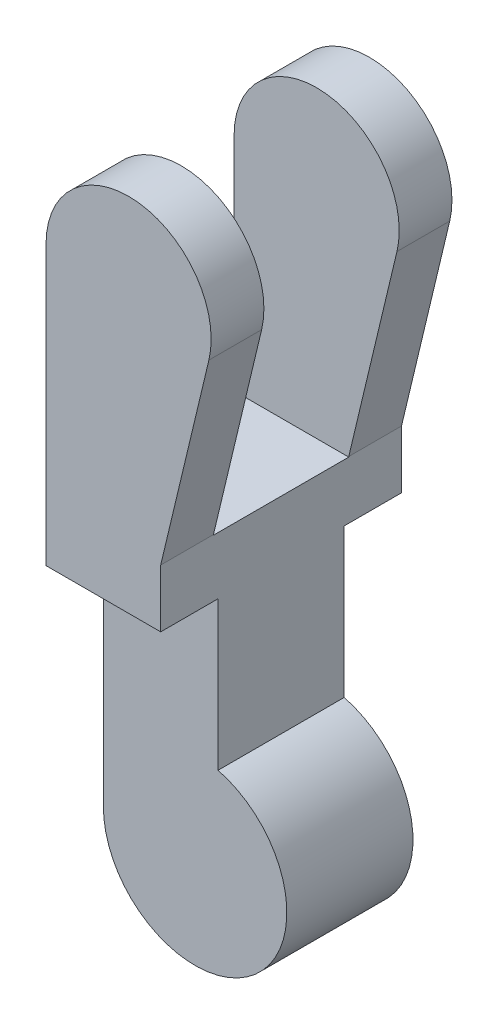
ISO-10303-21;
HEADER;
FILE_DESCRIPTION(('STEP AP214'),'2;1');
FILE_NAME('part.step','',(''),(''),'','','');
FILE_SCHEMA(('AUTOMOTIVE_DESIGN { 1 0 10303 214 1 1 1 1 }'));
ENDSEC;
DATA;
#1=APPLICATION_CONTEXT('core data for automotive mechanical design processes');
#2=APPLICATION_PROTOCOL_DEFINITION('international standard','automotive_design',2000,#1);
#3=PRODUCT_CONTEXT('',#1,'mechanical');
#4=PRODUCT('Part','Part','',(#3));
#5=PRODUCT_RELATED_PRODUCT_CATEGORY('part','',(#4));
#6=PRODUCT_DEFINITION_FORMATION('','',#4);
#7=PRODUCT_DEFINITION_CONTEXT('part definition',#1,'design');
#8=PRODUCT_DEFINITION('design','',#6,#7);
#9=PRODUCT_DEFINITION_SHAPE('','',#8);
#10=(LENGTH_UNIT() NAMED_UNIT(*) SI_UNIT(.MILLI.,.METRE.));
#11=(NAMED_UNIT(*) PLANE_ANGLE_UNIT() SI_UNIT($,.RADIAN.));
#12=(NAMED_UNIT(*) SI_UNIT($,.STERADIAN.) SOLID_ANGLE_UNIT());
#13=UNCERTAINTY_MEASURE_WITH_UNIT(LENGTH_MEASURE(1.E-05),#10,'distance_accuracy_value','');
#14=(GEOMETRIC_REPRESENTATION_CONTEXT(3) GLOBAL_UNCERTAINTY_ASSIGNED_CONTEXT((#13)) GLOBAL_UNIT_ASSIGNED_CONTEXT((#10,
#11,#12)) REPRESENTATION_CONTEXT('',''));
#15=CARTESIAN_POINT('',(0.,0.,0.));
#16=DIRECTION('',(0.,0.,1.));
#17=DIRECTION('',(1.,0.,0.));
#18=AXIS2_PLACEMENT_3D('',#15,#16,#17);
#19=CARTESIAN_POINT('',(20.,257.459666924148,105.));
#20=DIRECTION('',(-0.972594243663536,0.232509004540803,0.));
#21=DIRECTION('',(-0.232509004540803,-0.972594243663536,0.));
#22=AXIS2_PLACEMENT_3D('',#19,#20,#21);
#23=PLANE('',#22);
#24=DIRECTION('',(0.,0.,-1.));
#25=VECTOR('',#24,1.);
#26=CARTESIAN_POINT('',(20.,257.459666924148,105.));
#27=LINE('',#26,#25);
#28=CARTESIAN_POINT('',(20.,257.459666924148,105.));
#29=VERTEX_POINT('',#28);
#30=CARTESIAN_POINT('',(20.,257.459666924148,59.));
#31=VERTEX_POINT('',#30);
#32=EDGE_CURVE('E185',#29,#31,#27,.T.);
#33=ORIENTED_EDGE('',*,*,#32,.T.);
#34=DIRECTION('',(0.232509004540803,0.972594243663536,0.));
#35=VECTOR('',#34,1.);
#36=CARTESIAN_POINT('',(20.,257.459666924148,59.));
#37=LINE('',#36,#35);
#38=CARTESIAN_POINT('',(62.0267855437745,433.259351673062,59.));
#39=VERTEX_POINT('',#38);
#40=EDGE_CURVE('E241',#31,#39,#37,.T.);
#41=ORIENTED_EDGE('',*,*,#40,.T.);
#42=DIRECTION('',(0.,0.,-1.));
#43=VECTOR('',#42,1.);
#44=CARTESIAN_POINT('',(62.0267855437745,433.259351673062,105.));
#45=LINE('',#44,#43);
#46=CARTESIAN_POINT('',(62.0267855437745,433.259351673062,105.));
#47=VERTEX_POINT('',#46);
#48=EDGE_CURVE('E176',#47,#39,#45,.T.);
#49=ORIENTED_EDGE('',*,*,#48,.F.);
#50=DIRECTION('',(0.232509004540803,0.972594243663536,0.));
#51=VECTOR('',#50,1.);
#52=CARTESIAN_POINT('',(20.,257.459666924148,105.));
#53=LINE('',#52,#51);
#54=EDGE_CURVE('E251',#29,#47,#53,.T.);
#55=ORIENTED_EDGE('',*,*,#54,.F.);
#56=EDGE_LOOP('',(#33,#41,#49,#55));
#57=FACE_BOUND('',#56,.T.);
#58=ADVANCED_FACE('F39',(#57),#23,.F.);
#59=CARTESIAN_POINT('',(-8.00000000000001,450.,105.));
#60=DIRECTION('',(0.,0.,-1.));
#61=DIRECTION('',(-1.,0.,0.));
#62=AXIS2_PLACEMENT_3D('',#59,#60,#61);
#63=CYLINDRICAL_SURFACE('',#62,72.);
#64=CARTESIAN_POINT('',(-8.00000000000001,450.,59.));
#65=DIRECTION('',(0.,0.,1.));
#66=DIRECTION('',(0.,-1.,0.));
#67=AXIS2_PLACEMENT_3D('',#64,#65,#66);
#68=CIRCLE('',#67,72.);
#69=CARTESIAN_POINT('',(-80.,450.,59.));
#70=VERTEX_POINT('',#69);
#71=EDGE_CURVE('E238',#39,#70,#68,.T.);
#72=ORIENTED_EDGE('',*,*,#71,.T.);
#73=DIRECTION('',(0.,0.,-1.));
#74=VECTOR('',#73,1.);
#75=CARTESIAN_POINT('',(-80.,450.,105.));
#76=LINE('',#75,#74);
#77=CARTESIAN_POINT('',(-80.,450.,105.));
#78=VERTEX_POINT('',#77);
#79=EDGE_CURVE('E164',#78,#70,#76,.T.);
#80=ORIENTED_EDGE('',*,*,#79,.F.);
#81=CARTESIAN_POINT('',(-8.00000000000001,450.,105.));
#82=DIRECTION('',(0.,0.,1.));
#83=DIRECTION('',(1.,0.,0.));
#84=AXIS2_PLACEMENT_3D('',#81,#82,#83);
#85=CIRCLE('',#84,72.);
#86=EDGE_CURVE('E255',#47,#78,#85,.T.);
#87=ORIENTED_EDGE('',*,*,#86,.F.);
#88=ORIENTED_EDGE('',*,*,#48,.T.);
#89=EDGE_LOOP('',(#72,#80,#87,#88));
#90=FACE_BOUND('',#89,.T.);
#91=ADVANCED_FACE('F330',(#90),#63,.T.);
#92=CARTESIAN_POINT('',(0.,0.,105.));
#93=DIRECTION('',(0.,0.,-1.));
#94=DIRECTION('',(-1.,0.,0.));
#95=AXIS2_PLACEMENT_3D('',#92,#93,#94);
#96=CYLINDRICAL_SURFACE('',#95,80.);
#97=DIRECTION('',(0.,0.,-1.));
#98=VECTOR('',#97,1.);
#99=CARTESIAN_POINT('',(20.,77.4596669241483,105.));
#100=LINE('',#99,#98);
#101=CARTESIAN_POINT('',(20.,77.4596669241483,55.));
#102=VERTEX_POINT('',#101);
#103=CARTESIAN_POINT('',(20.,77.4596669241483,-55.));
#104=VERTEX_POINT('',#103);
#105=EDGE_CURVE('E48',#102,#104,#100,.T.);
#106=ORIENTED_EDGE('',*,*,#105,.F.);
#107=CARTESIAN_POINT('',(0.,0.,55.));
#108=DIRECTION('',(0.,0.,-1.));
#109=DIRECTION('',(0.,1.,0.));
#110=AXIS2_PLACEMENT_3D('',#107,#108,#109);
#111=CIRCLE('',#110,80.);
#112=CARTESIAN_POINT('',(-80.,0.,55.));
#113=VERTEX_POINT('',#112);
#114=EDGE_CURVE('E201',#102,#113,#111,.T.);
#115=ORIENTED_EDGE('',*,*,#114,.T.);
#116=DIRECTION('',(0.,0.,-1.));
#117=VECTOR('',#116,1.);
#118=CARTESIAN_POINT('',(-80.,0.,105.));
#119=LINE('',#118,#117);
#120=CARTESIAN_POINT('',(-80.,0.,-55.));
#121=VERTEX_POINT('',#120);
#122=EDGE_CURVE('E178',#113,#121,#119,.T.);
#123=ORIENTED_EDGE('',*,*,#122,.T.);
#124=CARTESIAN_POINT('',(0.,0.,-55.));
#125=DIRECTION('',(0.,0.,1.));
#126=DIRECTION('',(0.,-1.,0.));
#127=AXIS2_PLACEMENT_3D('',#124,#125,#126);
#128=CIRCLE('',#127,80.);
#129=EDGE_CURVE('E203',#121,#104,#128,.T.);
#130=ORIENTED_EDGE('',*,*,#129,.T.);
#131=EDGE_LOOP('',(#106,#115,#123,#130));
#132=FACE_BOUND('',#131,.T.);
#133=ADVANCED_FACE('F41',(#132),#96,.T.);
#134=CARTESIAN_POINT('',(20.,257.459666924148,105.));
#135=DIRECTION('',(-1.,0.,0.));
#136=DIRECTION('',(0.,-1.,0.));
#137=AXIS2_PLACEMENT_3D('',#134,#135,#136);
#138=PLANE('',#137);
#139=DIRECTION('',(0.,0.,1.));
#140=VECTOR('',#139,1.);
#141=CARTESIAN_POINT('',(20.,257.,105.));
#142=LINE('',#141,#140);
#143=CARTESIAN_POINT('',(20.,257.,-59.));
#144=VERTEX_POINT('',#143);
#145=CARTESIAN_POINT('',(20.,257.,59.));
#146=VERTEX_POINT('',#145);
#147=EDGE_CURVE('E224',#144,#146,#142,.T.);
#148=ORIENTED_EDGE('',*,*,#147,.T.);
#149=DIRECTION('',(0.,1.,0.));
#150=VECTOR('',#149,1.);
#151=CARTESIAN_POINT('',(20.,257.459666924148,59.));
#152=LINE('',#151,#150);
#153=EDGE_CURVE('E148',#146,#31,#152,.T.);
#154=ORIENTED_EDGE('',*,*,#153,.T.);
#155=ORIENTED_EDGE('',*,*,#32,.F.);
#156=DIRECTION('',(0.,1.,0.));
#157=VECTOR('',#156,1.);
#158=CARTESIAN_POINT('',(20.,257.459666924148,105.));
#159=LINE('',#158,#157);
#160=CARTESIAN_POINT('',(20.,207.,105.));
#161=VERTEX_POINT('',#160);
#162=EDGE_CURVE('E248',#161,#29,#159,.T.);
#163=ORIENTED_EDGE('',*,*,#162,.F.);
#164=DIRECTION('',(0.,0.,-1.));
#165=VECTOR('',#164,1.);
#166=CARTESIAN_POINT('',(20.,207.,105.));
#167=LINE('',#166,#165);
#168=CARTESIAN_POINT('',(20.,207.,55.));
#169=VERTEX_POINT('',#168);
#170=EDGE_CURVE('E63',#161,#169,#167,.T.);
#171=ORIENTED_EDGE('',*,*,#170,.T.);
#172=DIRECTION('',(0.,-1.,0.));
#173=VECTOR('',#172,1.);
#174=CARTESIAN_POINT('',(20.,257.459666924148,55.));
#175=LINE('',#174,#173);
#176=EDGE_CURVE('E198',#169,#102,#175,.T.);
#177=ORIENTED_EDGE('',*,*,#176,.T.);
#178=ORIENTED_EDGE('',*,*,#105,.T.);
#179=DIRECTION('',(0.,1.,0.));
#180=VECTOR('',#179,1.);
#181=CARTESIAN_POINT('',(20.,257.459666924148,-55.));
#182=LINE('',#181,#180);
#183=CARTESIAN_POINT('',(20.,207.,-55.));
#184=VERTEX_POINT('',#183);
#185=EDGE_CURVE('E197',#104,#184,#182,.T.);
#186=ORIENTED_EDGE('',*,*,#185,.T.);
#187=DIRECTION('',(0.,0.,-1.));
#188=VECTOR('',#187,1.);
#189=CARTESIAN_POINT('',(20.,207.,105.));
#190=LINE('',#189,#188);
#191=CARTESIAN_POINT('',(20.,207.,-105.));
#192=VERTEX_POINT('',#191);
#193=EDGE_CURVE('E216',#184,#192,#190,.T.);
#194=ORIENTED_EDGE('',*,*,#193,.T.);
#195=DIRECTION('',(0.,1.,0.));
#196=VECTOR('',#195,1.);
#197=CARTESIAN_POINT('',(20.,257.459666924148,-105.));
#198=LINE('',#197,#196);
#199=CARTESIAN_POINT('',(20.,257.459666924148,-105.));
#200=VERTEX_POINT('',#199);
#201=EDGE_CURVE('E247',#192,#200,#198,.T.);
#202=ORIENTED_EDGE('',*,*,#201,.T.);
#203=CARTESIAN_POINT('',(20.,257.459666924148,-59.));
#204=VERTEX_POINT('',#203);
#205=EDGE_CURVE('E184',#204,#200,#27,.T.);
#206=ORIENTED_EDGE('',*,*,#205,.F.);
#207=DIRECTION('',(0.,-1.,0.));
#208=VECTOR('',#207,1.);
#209=CARTESIAN_POINT('',(20.,257.459666924148,-59.));
#210=LINE('',#209,#208);
#211=EDGE_CURVE('E234',#204,#144,#210,.T.);
#212=ORIENTED_EDGE('',*,*,#211,.T.);
#213=EDGE_LOOP('',(#148,#154,#155,#163,#171,#177,#178,#186,#194,#202,#206,#212));
#214=FACE_BOUND('',#213,.T.);
#215=ADVANCED_FACE('F194',(#214),#138,.F.);
#216=CARTESIAN_POINT('',(62.0267855437745,433.259351673062,-59.));
#217=VERTEX_POINT('',#216);
#218=CARTESIAN_POINT('',(62.0267855437745,433.259351673062,-105.));
#219=VERTEX_POINT('',#218);
#220=EDGE_CURVE('E171',#217,#219,#45,.T.);
#221=ORIENTED_EDGE('',*,*,#220,.F.);
#222=DIRECTION('',(-0.232509004540803,-0.972594243663536,0.));
#223=VECTOR('',#222,1.);
#224=CARTESIAN_POINT('',(20.,257.459666924148,-59.));
#225=LINE('',#224,#223);
#226=EDGE_CURVE('E230',#217,#204,#225,.T.);
#227=ORIENTED_EDGE('',*,*,#226,.T.);
#228=ORIENTED_EDGE('',*,*,#205,.T.);
#229=DIRECTION('',(0.232509004540803,0.972594243663536,0.));
#230=VECTOR('',#229,1.);
#231=CARTESIAN_POINT('',(20.,257.459666924148,-105.));
#232=LINE('',#231,#230);
#233=EDGE_CURVE('E263',#200,#219,#232,.T.);
#234=ORIENTED_EDGE('',*,*,#233,.T.);
#235=EDGE_LOOP('',(#221,#227,#228,#234));
#236=FACE_BOUND('',#235,.T.);
#237=ADVANCED_FACE('F333',(#236),#23,.F.);
#238=CARTESIAN_POINT('',(-8.00000000000001,450.,-59.));
#239=DIRECTION('',(0.,0.,-1.));
#240=DIRECTION('',(0.,1.,0.));
#241=AXIS2_PLACEMENT_3D('',#238,#239,#240);
#242=CIRCLE('',#241,72.);
#243=CARTESIAN_POINT('',(-80.,450.,-59.));
#244=VERTEX_POINT('',#243);
#245=EDGE_CURVE('E227',#244,#217,#242,.T.);
#246=ORIENTED_EDGE('',*,*,#245,.T.);
#247=ORIENTED_EDGE('',*,*,#220,.T.);
#248=CARTESIAN_POINT('',(-8.00000000000001,450.,-105.));
#249=DIRECTION('',(0.,0.,1.));
#250=DIRECTION('',(1.,0.,0.));
#251=AXIS2_PLACEMENT_3D('',#248,#249,#250);
#252=CIRCLE('',#251,72.);
#253=CARTESIAN_POINT('',(-80.,450.,-105.));
#254=VERTEX_POINT('',#253);
#255=EDGE_CURVE('E267',#219,#254,#252,.T.);
#256=ORIENTED_EDGE('',*,*,#255,.T.);
#257=EDGE_CURVE('E172',#244,#254,#76,.T.);
#258=ORIENTED_EDGE('',*,*,#257,.F.);
#259=EDGE_LOOP('',(#246,#247,#256,#258));
#260=FACE_BOUND('',#259,.T.);
#261=ADVANCED_FACE('F338',(#260),#63,.T.);
#262=CARTESIAN_POINT('',(-80.,0.,105.));
#263=DIRECTION('',(1.,0.,0.));
#264=DIRECTION('',(0.,0.,-1.));
#265=AXIS2_PLACEMENT_3D('',#262,#263,#264);
#266=PLANE('',#265);
#267=ORIENTED_EDGE('',*,*,#79,.T.);
#268=DIRECTION('',(0.,-1.,0.));
#269=VECTOR('',#268,1.);
#270=CARTESIAN_POINT('',(-80.,0.,59.0000000000001));
#271=LINE('',#270,#269);
#272=CARTESIAN_POINT('',(-80.,257.,59.));
#273=VERTEX_POINT('',#272);
#274=EDGE_CURVE('E11',#70,#273,#271,.T.);
#275=ORIENTED_EDGE('',*,*,#274,.T.);
#276=DIRECTION('',(0.,0.,-1.));
#277=VECTOR('',#276,1.);
#278=CARTESIAN_POINT('',(-80.,257.,59.));
#279=LINE('',#278,#277);
#280=CARTESIAN_POINT('',(-80.,257.,-59.));
#281=VERTEX_POINT('',#280);
#282=EDGE_CURVE('E155',#273,#281,#279,.T.);
#283=ORIENTED_EDGE('',*,*,#282,.T.);
#284=DIRECTION('',(0.,1.,0.));
#285=VECTOR('',#284,1.);
#286=CARTESIAN_POINT('',(-80.,522.,-59.));
#287=LINE('',#286,#285);
#288=EDGE_CURVE('E55',#281,#244,#287,.T.);
#289=ORIENTED_EDGE('',*,*,#288,.T.);
#290=ORIENTED_EDGE('',*,*,#257,.T.);
#291=DIRECTION('',(0.,-1.,0.));
#292=VECTOR('',#291,1.);
#293=CARTESIAN_POINT('',(-80.,0.,-105.));
#294=LINE('',#293,#292);
#295=CARTESIAN_POINT('',(-80.,207.,-105.));
#296=VERTEX_POINT('',#295);
#297=EDGE_CURVE('E252',#254,#296,#294,.T.);
#298=ORIENTED_EDGE('',*,*,#297,.T.);
#299=DIRECTION('',(0.,0.,1.));
#300=VECTOR('',#299,1.);
#301=CARTESIAN_POINT('',(-80.,207.,-105.));
#302=LINE('',#301,#300);
#303=CARTESIAN_POINT('',(-80.,207.,-55.));
#304=VERTEX_POINT('',#303);
#305=EDGE_CURVE('E274',#296,#304,#302,.T.);
#306=ORIENTED_EDGE('',*,*,#305,.T.);
#307=DIRECTION('',(0.,-1.,0.));
#308=VECTOR('',#307,1.);
#309=CARTESIAN_POINT('',(-80.,207.,-55.));
#310=LINE('',#309,#308);
#311=EDGE_CURVE('E285',#304,#121,#310,.T.);
#312=ORIENTED_EDGE('',*,*,#311,.T.);
#313=ORIENTED_EDGE('',*,*,#122,.F.);
#314=DIRECTION('',(0.,1.,0.));
#315=VECTOR('',#314,1.);
#316=CARTESIAN_POINT('',(-80.,207.,55.));
#317=LINE('',#316,#315);
#318=CARTESIAN_POINT('',(-80.,207.,55.));
#319=VERTEX_POINT('',#318);
#320=EDGE_CURVE('E289',#113,#319,#317,.T.);
#321=ORIENTED_EDGE('',*,*,#320,.T.);
#322=DIRECTION('',(0.,0.,1.));
#323=VECTOR('',#322,1.);
#324=CARTESIAN_POINT('',(-80.,207.,105.));
#325=LINE('',#324,#323);
#326=CARTESIAN_POINT('',(-80.,207.,105.));
#327=VERTEX_POINT('',#326);
#328=EDGE_CURVE('E300',#319,#327,#325,.T.);
#329=ORIENTED_EDGE('',*,*,#328,.T.);
#330=DIRECTION('',(0.,-1.,0.));
#331=VECTOR('',#330,1.);
#332=CARTESIAN_POINT('',(-80.,0.,105.));
#333=LINE('',#332,#331);
#334=EDGE_CURVE('E167',#78,#327,#333,.T.);
#335=ORIENTED_EDGE('',*,*,#334,.F.);
#336=EDGE_LOOP('',(#267,#275,#283,#289,#290,#298,#306,#312,#313,#321,#329,#335));
#337=FACE_BOUND('',#336,.T.);
#338=ADVANCED_FACE('F161',(#337),#266,.F.);
#339=CARTESIAN_POINT('',(0.,0.,105.));
#340=DIRECTION('',(0.,0.,1.));
#341=DIRECTION('',(1.,0.,0.));
#342=AXIS2_PLACEMENT_3D('',#339,#340,#341);
#343=PLANE('',#342);
#344=DIRECTION('',(1.,0.,0.));
#345=VECTOR('',#344,1.);
#346=CARTESIAN_POINT('',(-80.,207.,105.));
#347=LINE('',#346,#345);
#348=EDGE_CURVE('E159',#327,#161,#347,.T.);
#349=ORIENTED_EDGE('',*,*,#348,.T.);
#350=ORIENTED_EDGE('',*,*,#162,.T.);
#351=ORIENTED_EDGE('',*,*,#54,.T.);
#352=ORIENTED_EDGE('',*,*,#86,.T.);
#353=ORIENTED_EDGE('',*,*,#334,.T.);
#354=EDGE_LOOP('',(#349,#350,#351,#352,#353));
#355=FACE_BOUND('',#354,.T.);
#356=ADVANCED_FACE('F316',(#355),#343,.T.);
#357=CARTESIAN_POINT('',(0.,0.,-105.));
#358=DIRECTION('',(0.,0.,1.));
#359=DIRECTION('',(1.,0.,0.));
#360=AXIS2_PLACEMENT_3D('',#357,#358,#359);
#361=PLANE('',#360);
#362=ORIENTED_EDGE('',*,*,#201,.F.);
#363=DIRECTION('',(1.,0.,0.));
#364=VECTOR('',#363,1.);
#365=CARTESIAN_POINT('',(-80.,207.,-105.));
#366=LINE('',#365,#364);
#367=EDGE_CURVE('E282',#296,#192,#366,.T.);
#368=ORIENTED_EDGE('',*,*,#367,.F.);
#369=ORIENTED_EDGE('',*,*,#297,.F.);
#370=ORIENTED_EDGE('',*,*,#255,.F.);
#371=ORIENTED_EDGE('',*,*,#233,.F.);
#372=EDGE_LOOP('',(#362,#368,#369,#370,#371));
#373=FACE_BOUND('',#372,.T.);
#374=ADVANCED_FACE('F280',(#373),#361,.F.);
#375=CARTESIAN_POINT('',(-80.,207.,-55.));
#376=DIRECTION('',(0.,0.,1.));
#377=DIRECTION('',(0.,-1.,0.));
#378=AXIS2_PLACEMENT_3D('',#375,#376,#377);
#379=PLANE('',#378);
#380=ORIENTED_EDGE('',*,*,#311,.F.);
#381=DIRECTION('',(1.,0.,0.));
#382=VECTOR('',#381,1.);
#383=CARTESIAN_POINT('',(-80.,207.,-55.));
#384=LINE('',#383,#382);
#385=EDGE_CURVE('E212',#304,#184,#384,.T.);
#386=ORIENTED_EDGE('',*,*,#385,.T.);
#387=ORIENTED_EDGE('',*,*,#185,.F.);
#388=ORIENTED_EDGE('',*,*,#129,.F.);
#389=EDGE_LOOP('',(#380,#386,#387,#388));
#390=FACE_BOUND('',#389,.T.);
#391=ADVANCED_FACE('F211',(#390),#379,.F.);
#392=CARTESIAN_POINT('',(-80.,207.,-105.));
#393=DIRECTION('',(0.,1.,0.));
#394=DIRECTION('',(0.,0.,1.));
#395=AXIS2_PLACEMENT_3D('',#392,#393,#394);
#396=PLANE('',#395);
#397=ORIENTED_EDGE('',*,*,#385,.F.);
#398=ORIENTED_EDGE('',*,*,#305,.F.);
#399=ORIENTED_EDGE('',*,*,#367,.T.);
#400=ORIENTED_EDGE('',*,*,#193,.F.);
#401=EDGE_LOOP('',(#397,#398,#399,#400));
#402=FACE_BOUND('',#401,.T.);
#403=ADVANCED_FACE('F320',(#402),#396,.F.);
#404=CARTESIAN_POINT('',(-80.,207.,55.));
#405=DIRECTION('',(0.,0.,-1.));
#406=DIRECTION('',(0.,1.,0.));
#407=AXIS2_PLACEMENT_3D('',#404,#405,#406);
#408=PLANE('',#407);
#409=ORIENTED_EDGE('',*,*,#114,.F.);
#410=ORIENTED_EDGE('',*,*,#176,.F.);
#411=DIRECTION('',(1.,0.,0.));
#412=VECTOR('',#411,1.);
#413=CARTESIAN_POINT('',(-80.,207.,55.));
#414=LINE('',#413,#412);
#415=EDGE_CURVE('E303',#319,#169,#414,.T.);
#416=ORIENTED_EDGE('',*,*,#415,.F.);
#417=ORIENTED_EDGE('',*,*,#320,.F.);
#418=EDGE_LOOP('',(#409,#410,#416,#417));
#419=FACE_BOUND('',#418,.T.);
#420=ADVANCED_FACE('F318',(#419),#408,.F.);
#421=CARTESIAN_POINT('',(-80.,207.,105.));
#422=DIRECTION('',(0.,1.,0.));
#423=DIRECTION('',(0.,0.,1.));
#424=AXIS2_PLACEMENT_3D('',#421,#422,#423);
#425=PLANE('',#424);
#426=ORIENTED_EDGE('',*,*,#348,.F.);
#427=ORIENTED_EDGE('',*,*,#328,.F.);
#428=ORIENTED_EDGE('',*,*,#415,.T.);
#429=ORIENTED_EDGE('',*,*,#170,.F.);
#430=EDGE_LOOP('',(#426,#427,#428,#429));
#431=FACE_BOUND('',#430,.T.);
#432=ADVANCED_FACE('F310',(#431),#425,.F.);
#433=CARTESIAN_POINT('',(-80.,522.,59.));
#434=DIRECTION('',(0.,0.,1.));
#435=DIRECTION('',(0.,-1.,0.));
#436=AXIS2_PLACEMENT_3D('',#433,#434,#435);
#437=PLANE('',#436);
#438=DIRECTION('',(1.,0.,0.));
#439=VECTOR('',#438,1.);
#440=CARTESIAN_POINT('',(-80.,257.,59.));
#441=LINE('',#440,#439);
#442=EDGE_CURVE('E143',#273,#146,#441,.T.);
#443=ORIENTED_EDGE('',*,*,#442,.F.);
#444=ORIENTED_EDGE('',*,*,#274,.F.);
#445=ORIENTED_EDGE('',*,*,#71,.F.);
#446=ORIENTED_EDGE('',*,*,#40,.F.);
#447=ORIENTED_EDGE('',*,*,#153,.F.);
#448=EDGE_LOOP('',(#443,#444,#445,#446,#447));
#449=FACE_BOUND('',#448,.T.);
#450=ADVANCED_FACE('F145',(#449),#437,.F.);
#451=CARTESIAN_POINT('',(-80.,522.,-59.));
#452=DIRECTION('',(0.,0.,-1.));
#453=DIRECTION('',(0.,1.,0.));
#454=AXIS2_PLACEMENT_3D('',#451,#452,#453);
#455=PLANE('',#454);
#456=ORIENTED_EDGE('',*,*,#226,.F.);
#457=ORIENTED_EDGE('',*,*,#245,.F.);
#458=ORIENTED_EDGE('',*,*,#288,.F.);
#459=DIRECTION('',(1.,0.,0.));
#460=VECTOR('',#459,1.);
#461=CARTESIAN_POINT('',(-80.,257.,-59.));
#462=LINE('',#461,#460);
#463=EDGE_CURVE('E152',#281,#144,#462,.T.);
#464=ORIENTED_EDGE('',*,*,#463,.T.);
#465=ORIENTED_EDGE('',*,*,#211,.F.);
#466=EDGE_LOOP('',(#456,#457,#458,#464,#465));
#467=FACE_BOUND('',#466,.T.);
#468=ADVANCED_FACE('F349',(#467),#455,.F.);
#469=CARTESIAN_POINT('',(-80.,257.,59.));
#470=DIRECTION('',(0.,-1.,0.));
#471=DIRECTION('',(0.,0.,-1.));
#472=AXIS2_PLACEMENT_3D('',#469,#470,#471);
#473=PLANE('',#472);
#474=ORIENTED_EDGE('',*,*,#463,.F.);
#475=ORIENTED_EDGE('',*,*,#282,.F.);
#476=ORIENTED_EDGE('',*,*,#442,.T.);
#477=ORIENTED_EDGE('',*,*,#147,.F.);
#478=EDGE_LOOP('',(#474,#475,#476,#477));
#479=FACE_BOUND('',#478,.T.);
#480=ADVANCED_FACE('F156',(#479),#473,.F.);
#481=CLOSED_SHELL('',(#58,#91,#133,#215,#237,#261,#338,#356,#374,#391,#403,#420,#432,#450,#468,#480));
#482=MANIFOLD_SOLID_BREP('B2',#481);
#483=ADVANCED_BREP_SHAPE_REPRESENTATION('',(#18,#482),#14);
#484=SHAPE_DEFINITION_REPRESENTATION(#9,#483);
ENDSEC;
END-ISO-10303-21;
